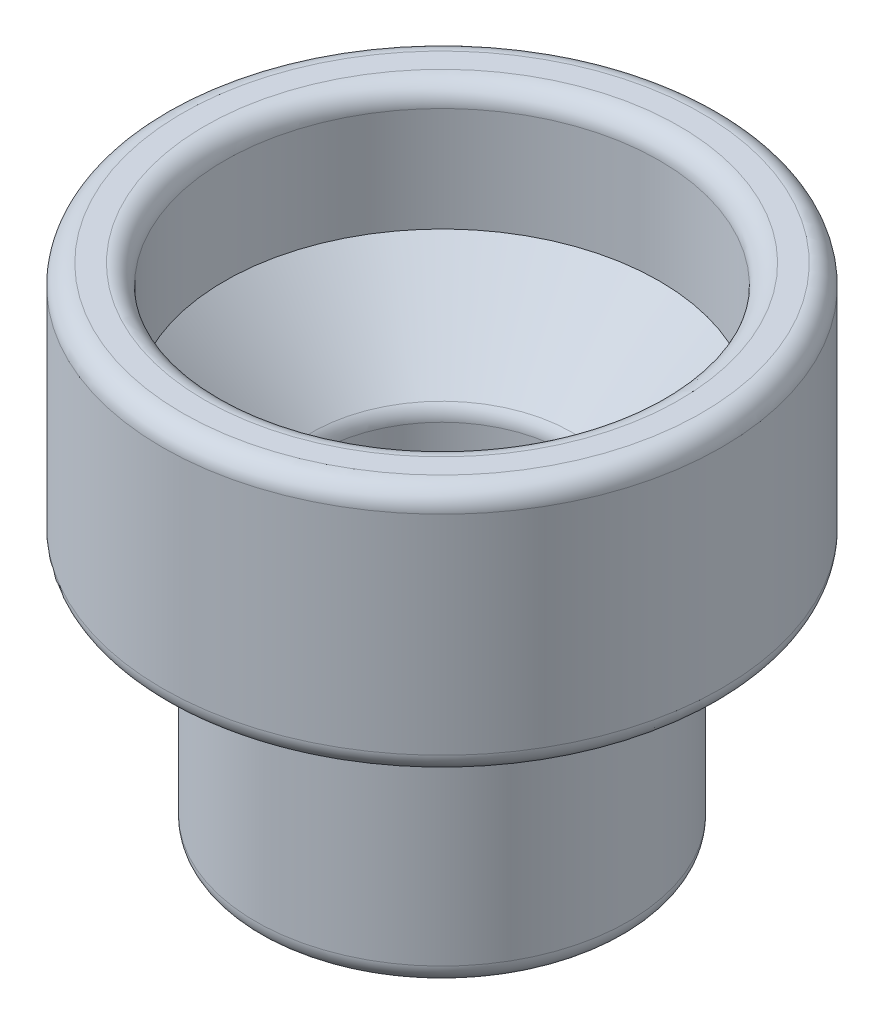
ISO-10303-21;
HEADER;
FILE_DESCRIPTION(('STEP AP214'),'2;1');
FILE_NAME('part.step','',(''),(''),'','','');
FILE_SCHEMA(('AUTOMOTIVE_DESIGN { 1 0 10303 214 1 1 1 1 }'));
ENDSEC;
DATA;
#1=APPLICATION_CONTEXT('core data for automotive mechanical design processes');
#2=APPLICATION_PROTOCOL_DEFINITION('international standard','automotive_design',2000,#1);
#3=PRODUCT_CONTEXT('',#1,'mechanical');
#4=PRODUCT('Part','Part','',(#3));
#5=PRODUCT_RELATED_PRODUCT_CATEGORY('part','',(#4));
#6=PRODUCT_DEFINITION_FORMATION('','',#4);
#7=PRODUCT_DEFINITION_CONTEXT('part definition',#1,'design');
#8=PRODUCT_DEFINITION('design','',#6,#7);
#9=PRODUCT_DEFINITION_SHAPE('','',#8);
#10=(LENGTH_UNIT() NAMED_UNIT(*) SI_UNIT(.MILLI.,.METRE.));
#11=(NAMED_UNIT(*) PLANE_ANGLE_UNIT() SI_UNIT($,.RADIAN.));
#12=(NAMED_UNIT(*) SI_UNIT($,.STERADIAN.) SOLID_ANGLE_UNIT());
#13=UNCERTAINTY_MEASURE_WITH_UNIT(LENGTH_MEASURE(1.E-05),#10,'distance_accuracy_value','');
#14=(GEOMETRIC_REPRESENTATION_CONTEXT(3) GLOBAL_UNCERTAINTY_ASSIGNED_CONTEXT((#13)) GLOBAL_UNIT_ASSIGNED_CONTEXT((#10,
#11,#12)) REPRESENTATION_CONTEXT('',''));
#15=CARTESIAN_POINT('',(0.,0.,0.));
#16=DIRECTION('',(0.,0.,1.));
#17=DIRECTION('',(1.,0.,0.));
#18=AXIS2_PLACEMENT_3D('',#15,#16,#17);
#19=CARTESIAN_POINT('',(0.,0.,0.));
#20=DIRECTION('',(0.,-1.,0.));
#21=DIRECTION('',(0.,0.,-1.));
#22=AXIS2_PLACEMENT_3D('',#19,#20,#21);
#23=CYLINDRICAL_SURFACE('',#22,6.35);
#24=CARTESIAN_POINT('',(0.,1.16665902062895,0.));
#25=DIRECTION('',(0.,1.,0.));
#26=DIRECTION('',(0.,0.,1.));
#27=AXIS2_PLACEMENT_3D('',#24,#25,#26);
#28=CIRCLE('',#27,6.35);
#29=CARTESIAN_POINT('',(0.,1.16665902062895,6.35));
#30=VERTEX_POINT('',#29);
#31=EDGE_CURVE('E77',#30,#30,#28,.T.);
#32=ORIENTED_EDGE('',*,*,#31,.T.);
#33=EDGE_LOOP('',(#32));
#34=FACE_BOUND('',#33,.T.);
#35=CARTESIAN_POINT('',(0.,-12.7,0.));
#36=DIRECTION('',(0.,-1.,0.));
#37=DIRECTION('',(0.,0.,-1.));
#38=AXIS2_PLACEMENT_3D('',#35,#36,#37);
#39=CIRCLE('',#38,6.35);
#40=CARTESIAN_POINT('',(0.,-12.7,-6.35));
#41=VERTEX_POINT('',#40);
#42=EDGE_CURVE('E85',#41,#41,#39,.T.);
#43=ORIENTED_EDGE('',*,*,#42,.T.);
#44=EDGE_LOOP('',(#43));
#45=FACE_BOUND('',#44,.T.);
#46=ADVANCED_FACE('F37',(#34,#45),#23,.F.);
#47=CARTESIAN_POINT('',(6.35,-12.7,0.));
#48=DIRECTION('',(0.,-1.,0.));
#49=DIRECTION('',(0.,0.,-1.));
#50=AXIS2_PLACEMENT_3D('',#47,#48,#49);
#51=PLANE('',#50);
#52=CARTESIAN_POINT('',(0.,-12.7,0.));
#53=DIRECTION('',(0.,-1.,0.));
#54=DIRECTION('',(0.,0.,-1.));
#55=AXIS2_PLACEMENT_3D('',#52,#53,#54);
#56=CIRCLE('',#55,8.509);
#57=CARTESIAN_POINT('',(0.,-12.7,-8.509));
#58=VERTEX_POINT('',#57);
#59=EDGE_CURVE('E61',#58,#58,#56,.T.);
#60=ORIENTED_EDGE('',*,*,#59,.T.);
#61=EDGE_LOOP('',(#60));
#62=FACE_BOUND('',#61,.T.);
#63=ORIENTED_EDGE('',*,*,#42,.F.);
#64=EDGE_LOOP('',(#63));
#65=FACE_BOUND('',#64,.T.);
#66=ADVANCED_FACE('F115',(#62,#65),#51,.T.);
#67=CARTESIAN_POINT('',(0.,0.,0.));
#68=DIRECTION('',(0.,-1.,0.));
#69=DIRECTION('',(0.,0.,-1.));
#70=AXIS2_PLACEMENT_3D('',#67,#68,#69);
#71=CYLINDRICAL_SURFACE('',#70,9.525);
#72=CARTESIAN_POINT('',(0.,-11.684,0.));
#73=DIRECTION('',(0.,-1.,0.));
#74=DIRECTION('',(0.,0.,-1.));
#75=AXIS2_PLACEMENT_3D('',#72,#73,#74);
#76=CIRCLE('',#75,9.525);
#77=CARTESIAN_POINT('',(0.,-11.684,-9.525));
#78=VERTEX_POINT('',#77);
#79=EDGE_CURVE('E55',#78,#78,#76,.F.);
#80=ORIENTED_EDGE('',*,*,#79,.T.);
#81=EDGE_LOOP('',(#80));
#82=FACE_BOUND('',#81,.T.);
#83=CARTESIAN_POINT('',(0.,0.,0.));
#84=DIRECTION('',(0.,-1.,0.));
#85=DIRECTION('',(0.,0.,-1.));
#86=AXIS2_PLACEMENT_3D('',#83,#84,#85);
#87=CIRCLE('',#86,9.525);
#88=CARTESIAN_POINT('',(0.,0.,-9.525));
#89=VERTEX_POINT('',#88);
#90=EDGE_CURVE('E89',#89,#89,#87,.T.);
#91=ORIENTED_EDGE('',*,*,#90,.T.);
#92=EDGE_LOOP('',(#91));
#93=FACE_BOUND('',#92,.T.);
#94=ADVANCED_FACE('F121',(#82,#93),#71,.T.);
#95=CARTESIAN_POINT('',(9.525,0.,0.));
#96=DIRECTION('',(0.,-1.,0.));
#97=DIRECTION('',(0.,0.,-1.));
#98=AXIS2_PLACEMENT_3D('',#95,#96,#97);
#99=PLANE('',#98);
#100=CARTESIAN_POINT('',(0.,0.,0.));
#101=DIRECTION('',(0.,-1.,0.));
#102=DIRECTION('',(0.,0.,-1.));
#103=AXIS2_PLACEMENT_3D('',#100,#101,#102);
#104=CIRCLE('',#103,13.2715);
#105=CARTESIAN_POINT('',(0.,0.,-13.2715));
#106=VERTEX_POINT('',#105);
#107=EDGE_CURVE('E73',#106,#106,#104,.T.);
#108=ORIENTED_EDGE('',*,*,#107,.T.);
#109=EDGE_LOOP('',(#108));
#110=FACE_BOUND('',#109,.T.);
#111=ORIENTED_EDGE('',*,*,#90,.F.);
#112=EDGE_LOOP('',(#111));
#113=FACE_BOUND('',#112,.T.);
#114=ADVANCED_FACE('F145',(#110,#113),#99,.T.);
#115=CARTESIAN_POINT('',(0.,0.,0.));
#116=DIRECTION('',(0.,-1.,0.));
#117=DIRECTION('',(0.,0.,-1.));
#118=AXIS2_PLACEMENT_3D('',#115,#116,#117);
#119=CYLINDRICAL_SURFACE('',#118,14.2875);
#120=CARTESIAN_POINT('',(0.,1.016,0.));
#121=DIRECTION('',(0.,-1.,0.));
#122=DIRECTION('',(0.,0.,-1.));
#123=AXIS2_PLACEMENT_3D('',#120,#121,#122);
#124=CIRCLE('',#123,14.2875);
#125=CARTESIAN_POINT('',(0.,1.016,-14.2875));
#126=VERTEX_POINT('',#125);
#127=EDGE_CURVE('E65',#126,#126,#124,.F.);
#128=ORIENTED_EDGE('',*,*,#127,.T.);
#129=EDGE_LOOP('',(#128));
#130=FACE_BOUND('',#129,.T.);
#131=CARTESIAN_POINT('',(0.,11.684,0.));
#132=DIRECTION('',(0.,1.,0.));
#133=DIRECTION('',(0.,0.,1.));
#134=AXIS2_PLACEMENT_3D('',#131,#132,#133);
#135=CIRCLE('',#134,14.2875);
#136=CARTESIAN_POINT('',(0.,11.684,14.2875));
#137=VERTEX_POINT('',#136);
#138=EDGE_CURVE('E69',#137,#137,#135,.F.);
#139=ORIENTED_EDGE('',*,*,#138,.T.);
#140=EDGE_LOOP('',(#139));
#141=FACE_BOUND('',#140,.T.);
#142=ADVANCED_FACE('F143',(#130,#141),#119,.T.);
#143=CARTESIAN_POINT('',(11.1125,12.7,0.));
#144=DIRECTION('',(0.,1.,0.));
#145=DIRECTION('',(0.,0.,1.));
#146=AXIS2_PLACEMENT_3D('',#143,#144,#145);
#147=PLANE('',#146);
#148=CARTESIAN_POINT('',(0.,12.7,0.));
#149=DIRECTION('',(0.,1.,0.));
#150=DIRECTION('',(0.,0.,1.));
#151=AXIS2_PLACEMENT_3D('',#148,#149,#150);
#152=CIRCLE('',#151,13.2715);
#153=CARTESIAN_POINT('',(0.,12.7,13.2715));
#154=VERTEX_POINT('',#153);
#155=EDGE_CURVE('E45',#154,#154,#152,.T.);
#156=ORIENTED_EDGE('',*,*,#155,.T.);
#157=EDGE_LOOP('',(#156));
#158=FACE_BOUND('',#157,.T.);
#159=CARTESIAN_POINT('',(0.,12.7,0.));
#160=DIRECTION('',(0.,1.,0.));
#161=DIRECTION('',(0.,0.,1.));
#162=AXIS2_PLACEMENT_3D('',#159,#160,#161);
#163=CIRCLE('',#162,12.1285);
#164=CARTESIAN_POINT('',(0.,12.7,12.1285));
#165=VERTEX_POINT('',#164);
#166=EDGE_CURVE('E50',#165,#165,#163,.F.);
#167=ORIENTED_EDGE('',*,*,#166,.T.);
#168=EDGE_LOOP('',(#167));
#169=FACE_BOUND('',#168,.T.);
#170=ADVANCED_FACE('F112',(#158,#169),#147,.T.);
#171=CARTESIAN_POINT('',(0.,0.,0.));
#172=DIRECTION('',(0.,-1.,0.));
#173=DIRECTION('',(0.,0.,-1.));
#174=AXIS2_PLACEMENT_3D('',#171,#172,#173);
#175=CYLINDRICAL_SURFACE('',#174,11.1125);
#176=CARTESIAN_POINT('',(0.,11.684,0.));
#177=DIRECTION('',(0.,1.,0.));
#178=DIRECTION('',(0.,0.,1.));
#179=AXIS2_PLACEMENT_3D('',#176,#177,#178);
#180=CIRCLE('',#179,11.1125);
#181=CARTESIAN_POINT('',(0.,11.684,11.1125));
#182=VERTEX_POINT('',#181);
#183=EDGE_CURVE('E10',#182,#182,#180,.T.);
#184=ORIENTED_EDGE('',*,*,#183,.T.);
#185=EDGE_LOOP('',(#184));
#186=FACE_BOUND('',#185,.T.);
#187=CARTESIAN_POINT('',(0.,6.35,0.));
#188=DIRECTION('',(0.,-1.,0.));
#189=DIRECTION('',(0.,0.,-1.));
#190=AXIS2_PLACEMENT_3D('',#187,#188,#189);
#191=CIRCLE('',#190,11.1125);
#192=CARTESIAN_POINT('',(0.,6.35,-11.1125));
#193=VERTEX_POINT('',#192);
#194=EDGE_CURVE('E93',#193,#193,#191,.T.);
#195=ORIENTED_EDGE('',*,*,#194,.T.);
#196=EDGE_LOOP('',(#195));
#197=FACE_BOUND('',#196,.T.);
#198=ADVANCED_FACE('F98',(#186,#197),#175,.F.);
#199=CARTESIAN_POINT('',(0.,6.35,0.));
#200=DIRECTION('',(0.,1.,0.));
#201=DIRECTION('',(0.,0.,1.));
#202=AXIS2_PLACEMENT_3D('',#199,#200,#201);
#203=CONICAL_SURFACE('',#202,11.1125,0.78539816339745);
#204=CARTESIAN_POINT('',(0.,1.88507951031448,0.));
#205=DIRECTION('',(0.,-1.,0.));
#206=DIRECTION('',(0.,0.,-1.));
#207=AXIS2_PLACEMENT_3D('',#204,#205,#206);
#208=CIRCLE('',#207,6.64757951031447);
#209=CARTESIAN_POINT('',(0.,1.88507951031448,-6.64757951031447));
#210=VERTEX_POINT('',#209);
#211=EDGE_CURVE('E81',#210,#210,#208,.T.);
#212=ORIENTED_EDGE('',*,*,#211,.T.);
#213=EDGE_LOOP('',(#212));
#214=FACE_BOUND('',#213,.T.);
#215=ORIENTED_EDGE('',*,*,#194,.F.);
#216=EDGE_LOOP('',(#215));
#217=FACE_BOUND('',#216,.T.);
#218=ADVANCED_FACE('F100',(#214,#217),#203,.F.);
#219=CARTESIAN_POINT('',(0.,1.16665902062895,0.));
#220=DIRECTION('',(0.,1.,0.));
#221=DIRECTION('',(0.,0.,1.));
#222=AXIS2_PLACEMENT_3D('',#219,#220,#221);
#223=TOROIDAL_SURFACE('',#222,7.366,1.016);
#224=ORIENTED_EDGE('',*,*,#31,.F.);
#225=EDGE_LOOP('',(#224));
#226=FACE_BOUND('',#225,.T.);
#227=ORIENTED_EDGE('',*,*,#211,.F.);
#228=EDGE_LOOP('',(#227));
#229=FACE_BOUND('',#228,.T.);
#230=ADVANCED_FACE('F102',(#226,#229),#223,.T.);
#231=CARTESIAN_POINT('',(0.,1.016,0.));
#232=DIRECTION('',(0.,-1.,0.));
#233=DIRECTION('',(0.,0.,-1.));
#234=AXIS2_PLACEMENT_3D('',#231,#232,#233);
#235=TOROIDAL_SURFACE('',#234,13.2715,1.016);
#236=ORIENTED_EDGE('',*,*,#127,.F.);
#237=EDGE_LOOP('',(#236));
#238=FACE_BOUND('',#237,.T.);
#239=ORIENTED_EDGE('',*,*,#107,.F.);
#240=EDGE_LOOP('',(#239));
#241=FACE_BOUND('',#240,.T.);
#242=ADVANCED_FACE('F109',(#238,#241),#235,.T.);
#243=CARTESIAN_POINT('',(0.,-11.684,0.));
#244=DIRECTION('',(0.,-1.,0.));
#245=DIRECTION('',(0.,0.,-1.));
#246=AXIS2_PLACEMENT_3D('',#243,#244,#245);
#247=TOROIDAL_SURFACE('',#246,8.509,1.016);
#248=ORIENTED_EDGE('',*,*,#79,.F.);
#249=EDGE_LOOP('',(#248));
#250=FACE_BOUND('',#249,.T.);
#251=ORIENTED_EDGE('',*,*,#59,.F.);
#252=EDGE_LOOP('',(#251));
#253=FACE_BOUND('',#252,.T.);
#254=ADVANCED_FACE('F129',(#250,#253),#247,.T.);
#255=CARTESIAN_POINT('',(0.,11.684,0.));
#256=DIRECTION('',(0.,1.,0.));
#257=DIRECTION('',(0.,0.,1.));
#258=AXIS2_PLACEMENT_3D('',#255,#256,#257);
#259=TOROIDAL_SURFACE('',#258,13.2715,1.016);
#260=ORIENTED_EDGE('',*,*,#155,.F.);
#261=EDGE_LOOP('',(#260));
#262=FACE_BOUND('',#261,.T.);
#263=ORIENTED_EDGE('',*,*,#138,.F.);
#264=EDGE_LOOP('',(#263));
#265=FACE_BOUND('',#264,.T.);
#266=ADVANCED_FACE('F132',(#262,#265),#259,.T.);
#267=CARTESIAN_POINT('',(0.,11.684,0.));
#268=DIRECTION('',(0.,1.,0.));
#269=DIRECTION('',(0.,0.,1.));
#270=AXIS2_PLACEMENT_3D('',#267,#268,#269);
#271=TOROIDAL_SURFACE('',#270,12.1285,1.016);
#272=ORIENTED_EDGE('',*,*,#183,.F.);
#273=EDGE_LOOP('',(#272));
#274=FACE_BOUND('',#273,.T.);
#275=ORIENTED_EDGE('',*,*,#166,.F.);
#276=EDGE_LOOP('',(#275));
#277=FACE_BOUND('',#276,.T.);
#278=ADVANCED_FACE('F39',(#274,#277),#271,.T.);
#279=CLOSED_SHELL('',(#46,#66,#94,#114,#142,#170,#198,#218,#230,#242,#254,#266,#278));
#280=MANIFOLD_SOLID_BREP('B2',#279);
#281=ADVANCED_BREP_SHAPE_REPRESENTATION('',(#18,#280),#14);
#282=SHAPE_DEFINITION_REPRESENTATION(#9,#281);
ENDSEC;
END-ISO-10303-21;
